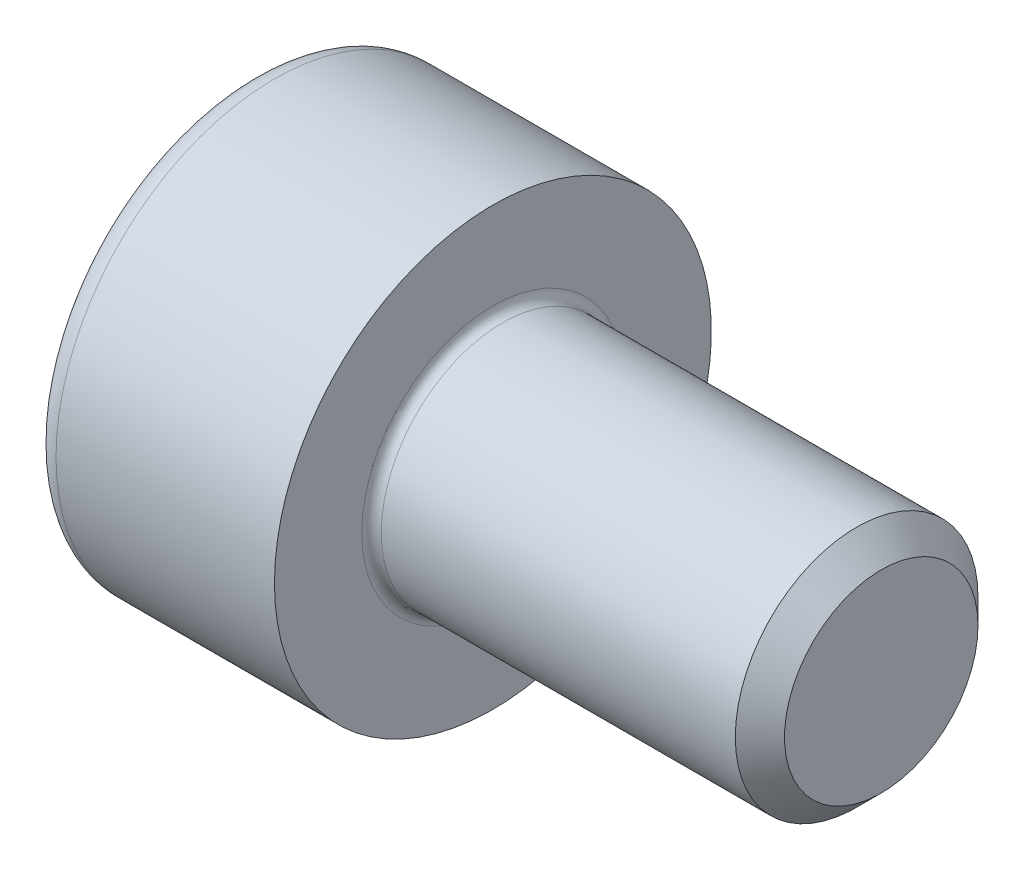
ISO-10303-21;
HEADER;
FILE_DESCRIPTION(('STEP AP214'),'2;1');
FILE_NAME('part.step','',(''),(''),'','','');
FILE_SCHEMA(('AUTOMOTIVE_DESIGN { 1 0 10303 214 1 1 1 1 }'));
ENDSEC;
DATA;
#1=APPLICATION_CONTEXT('core data for automotive mechanical design processes');
#2=APPLICATION_PROTOCOL_DEFINITION('international standard','automotive_design',2000,#1);
#3=PRODUCT_CONTEXT('',#1,'mechanical');
#4=PRODUCT('Part','Part','',(#3));
#5=PRODUCT_RELATED_PRODUCT_CATEGORY('part','',(#4));
#6=PRODUCT_DEFINITION_FORMATION('','',#4);
#7=PRODUCT_DEFINITION_CONTEXT('part definition',#1,'design');
#8=PRODUCT_DEFINITION('design','',#6,#7);
#9=PRODUCT_DEFINITION_SHAPE('','',#8);
#10=(LENGTH_UNIT() NAMED_UNIT(*) SI_UNIT(.MILLI.,.METRE.));
#11=(NAMED_UNIT(*) PLANE_ANGLE_UNIT() SI_UNIT($,.RADIAN.));
#12=(NAMED_UNIT(*) SI_UNIT($,.STERADIAN.) SOLID_ANGLE_UNIT());
#13=UNCERTAINTY_MEASURE_WITH_UNIT(LENGTH_MEASURE(1.E-05),#10,'distance_accuracy_value','');
#14=(GEOMETRIC_REPRESENTATION_CONTEXT(3) GLOBAL_UNCERTAINTY_ASSIGNED_CONTEXT((#13)) GLOBAL_UNIT_ASSIGNED_CONTEXT((#10,
#11,#12)) REPRESENTATION_CONTEXT('',''));
#15=CARTESIAN_POINT('',(0.,0.,0.));
#16=DIRECTION('',(0.,0.,1.));
#17=DIRECTION('',(1.,0.,0.));
#18=AXIS2_PLACEMENT_3D('',#15,#16,#17);
#19=CARTESIAN_POINT('',(1.1,0.,0.));
#20=DIRECTION('',(-1.,0.,0.));
#21=DIRECTION('',(0.,0.,1.));
#22=AXIS2_PLACEMENT_3D('',#19,#20,#21);
#23=PLANE('',#22);
#24=DIRECTION('',(0.,-1.,0.));
#25=VECTOR('',#24,1.);
#26=CARTESIAN_POINT('',(1.1,0.583123771881514,-1.01));
#27=LINE('',#26,#25);
#28=CARTESIAN_POINT('',(1.1,0.583123771881514,-1.01));
#29=VERTEX_POINT('',#28);
#30=CARTESIAN_POINT('',(1.10000000034899,0.,-1.01));
#31=VERTEX_POINT('',#30);
#32=EDGE_CURVE('E249',#29,#31,#27,.T.);
#33=ORIENTED_EDGE('',*,*,#32,.T.);
#34=CARTESIAN_POINT('',(1.10000000034899,0.,0.));
#35=DIRECTION('',(1.,0.,0.));
#36=DIRECTION('',(0.,0.,-1.));
#37=AXIS2_PLACEMENT_3D('',#34,#35,#36);
#38=CIRCLE('',#37,1.01000000021492);
#39=CARTESIAN_POINT('',(1.10000000034899,0.87468565800841,-0.505000000107462));
#40=VERTEX_POINT('',#39);
#41=EDGE_CURVE('E49',#31,#40,#38,.T.);
#42=ORIENTED_EDGE('',*,*,#41,.T.);
#43=DIRECTION('',(0.,-0.500000000000001,-0.866025403784438));
#44=VECTOR('',#43,1.);
#45=CARTESIAN_POINT('',(1.1,1.16624754376304,0.));
#46=LINE('',#45,#44);
#47=EDGE_CURVE('E265',#40,#29,#46,.T.);
#48=ORIENTED_EDGE('',*,*,#47,.T.);
#49=EDGE_LOOP('',(#33,#42,#48));
#50=FACE_BOUND('',#49,.T.);
#51=ADVANCED_FACE('F34',(#50),#23,.T.);
#52=CARTESIAN_POINT('',(1.1,1.16624754376304,0.));
#53=VERTEX_POINT('',#52);
#54=EDGE_CURVE('E213',#53,#40,#46,.T.);
#55=ORIENTED_EDGE('',*,*,#54,.T.);
#56=CARTESIAN_POINT('',(1.10000000034899,0.874685658008412,0.505000000107459));
#57=VERTEX_POINT('',#56);
#58=EDGE_CURVE('E210',#40,#57,#38,.T.);
#59=ORIENTED_EDGE('',*,*,#58,.T.);
#60=DIRECTION('',(0.,0.499999999999998,-0.86602540378444));
#61=VECTOR('',#60,1.);
#62=CARTESIAN_POINT('',(1.1,0.583123771881518,1.00999999999999));
#63=LINE('',#62,#61);
#64=EDGE_CURVE('E262',#57,#53,#63,.T.);
#65=ORIENTED_EDGE('',*,*,#64,.T.);
#66=EDGE_LOOP('',(#55,#59,#65));
#67=FACE_BOUND('',#66,.T.);
#68=ADVANCED_FACE('F124',(#67),#23,.T.);
#69=CARTESIAN_POINT('',(1.1,0.583123771881518,1.00999999999999));
#70=VERTEX_POINT('',#69);
#71=EDGE_CURVE('E263',#70,#57,#63,.T.);
#72=ORIENTED_EDGE('',*,*,#71,.T.);
#73=CARTESIAN_POINT('',(1.10000000034899,0.,1.01000000021492));
#74=VERTEX_POINT('',#73);
#75=EDGE_CURVE('E243',#57,#74,#38,.T.);
#76=ORIENTED_EDGE('',*,*,#75,.T.);
#77=DIRECTION('',(0.,1.,0.));
#78=VECTOR('',#77,1.);
#79=CARTESIAN_POINT('',(1.1,-0.583123771881526,1.01));
#80=LINE('',#79,#78);
#81=EDGE_CURVE('E259',#74,#70,#80,.T.);
#82=ORIENTED_EDGE('',*,*,#81,.T.);
#83=EDGE_LOOP('',(#72,#76,#82));
#84=FACE_BOUND('',#83,.T.);
#85=ADVANCED_FACE('F129',(#84),#23,.T.);
#86=CARTESIAN_POINT('',(1.1,-0.583123771881526,1.01));
#87=VERTEX_POINT('',#86);
#88=EDGE_CURVE('E260',#87,#74,#80,.T.);
#89=ORIENTED_EDGE('',*,*,#88,.T.);
#90=CARTESIAN_POINT('',(1.10000000034899,-0.87468565800841,0.505000000107462));
#91=VERTEX_POINT('',#90);
#92=EDGE_CURVE('E247',#74,#91,#38,.T.);
#93=ORIENTED_EDGE('',*,*,#92,.T.);
#94=DIRECTION('',(0.,0.500000000000001,0.866025403784438));
#95=VECTOR('',#94,1.);
#96=CARTESIAN_POINT('',(1.1,-1.16624754376305,0.));
#97=LINE('',#96,#95);
#98=EDGE_CURVE('E255',#91,#87,#97,.T.);
#99=ORIENTED_EDGE('',*,*,#98,.T.);
#100=EDGE_LOOP('',(#89,#93,#99));
#101=FACE_BOUND('',#100,.T.);
#102=ADVANCED_FACE('F282',(#101),#23,.T.);
#103=CARTESIAN_POINT('',(1.1,-1.16624754376305,0.));
#104=VERTEX_POINT('',#103);
#105=EDGE_CURVE('E256',#104,#91,#97,.T.);
#106=ORIENTED_EDGE('',*,*,#105,.T.);
#107=CARTESIAN_POINT('',(1.10000000034899,-0.874685658008412,-0.505000000107459));
#108=VERTEX_POINT('',#107);
#109=EDGE_CURVE('E276',#91,#108,#38,.T.);
#110=ORIENTED_EDGE('',*,*,#109,.T.);
#111=DIRECTION('',(0.,-0.499999999999998,0.86602540378444));
#112=VECTOR('',#111,1.);
#113=CARTESIAN_POINT('',(1.1,-0.583123771881529,-1.01));
#114=LINE('',#113,#112);
#115=EDGE_CURVE('E251',#108,#104,#114,.T.);
#116=ORIENTED_EDGE('',*,*,#115,.T.);
#117=EDGE_LOOP('',(#106,#110,#116));
#118=FACE_BOUND('',#117,.T.);
#119=ADVANCED_FACE('F122',(#118),#23,.T.);
#120=CARTESIAN_POINT('',(2.5,0.,0.));
#121=DIRECTION('',(-1.,0.,0.));
#122=DIRECTION('',(0.,0.,1.));
#123=AXIS2_PLACEMENT_3D('',#120,#121,#122);
#124=CYLINDRICAL_SURFACE('',#123,2.25);
#125=CARTESIAN_POINT('',(0.25,0.,0.));
#126=DIRECTION('',(-1.,0.,0.));
#127=DIRECTION('',(0.,0.,1.));
#128=AXIS2_PLACEMENT_3D('',#125,#126,#127);
#129=CIRCLE('',#128,2.25);
#130=CARTESIAN_POINT('',(0.25,0.,2.25));
#131=VERTEX_POINT('',#130);
#132=EDGE_CURVE('E11',#131,#131,#129,.F.);
#133=ORIENTED_EDGE('',*,*,#132,.T.);
#134=EDGE_LOOP('',(#133));
#135=FACE_BOUND('',#134,.T.);
#136=CARTESIAN_POINT('',(2.5,0.,0.));
#137=DIRECTION('',(-1.,0.,0.));
#138=DIRECTION('',(0.,0.,1.));
#139=AXIS2_PLACEMENT_3D('',#136,#137,#138);
#140=CIRCLE('',#139,2.25);
#141=CARTESIAN_POINT('',(2.5,0.,2.25));
#142=VERTEX_POINT('',#141);
#143=EDGE_CURVE('E228',#142,#142,#140,.T.);
#144=ORIENTED_EDGE('',*,*,#143,.T.);
#145=EDGE_LOOP('',(#144));
#146=FACE_BOUND('',#145,.T.);
#147=ADVANCED_FACE('F170',(#135,#146),#124,.T.);
#148=CARTESIAN_POINT('',(2.5,2.25,0.));
#149=DIRECTION('',(1.,0.,0.));
#150=DIRECTION('',(0.,0.,-1.));
#151=AXIS2_PLACEMENT_3D('',#148,#149,#150);
#152=PLANE('',#151);
#153=CARTESIAN_POINT('',(2.5,0.,0.));
#154=DIRECTION('',(1.,0.,0.));
#155=DIRECTION('',(0.,0.,-1.));
#156=AXIS2_PLACEMENT_3D('',#153,#154,#155);
#157=CIRCLE('',#156,1.35);
#158=CARTESIAN_POINT('',(2.5,0.,-1.35));
#159=VERTEX_POINT('',#158);
#160=EDGE_CURVE('E183',#159,#159,#157,.F.);
#161=ORIENTED_EDGE('',*,*,#160,.T.);
#162=EDGE_LOOP('',(#161));
#163=FACE_BOUND('',#162,.T.);
#164=ORIENTED_EDGE('',*,*,#143,.F.);
#165=EDGE_LOOP('',(#164));
#166=FACE_BOUND('',#165,.T.);
#167=ADVANCED_FACE('F166',(#163,#166),#152,.T.);
#168=CARTESIAN_POINT('',(0.,0.,0.));
#169=DIRECTION('',(-1.,0.,0.));
#170=DIRECTION('',(0.,0.,1.));
#171=AXIS2_PLACEMENT_3D('',#168,#169,#170);
#172=PLANE('',#171);
#173=CARTESIAN_POINT('',(0.,0.,0.));
#174=DIRECTION('',(-1.,0.,0.));
#175=DIRECTION('',(0.,0.,1.));
#176=AXIS2_PLACEMENT_3D('',#173,#174,#175);
#177=CIRCLE('',#176,2.);
#178=CARTESIAN_POINT('',(0.,0.,2.));
#179=VERTEX_POINT('',#178);
#180=EDGE_CURVE('E42',#179,#179,#177,.T.);
#181=ORIENTED_EDGE('',*,*,#180,.T.);
#182=EDGE_LOOP('',(#181));
#183=FACE_BOUND('',#182,.T.);
#184=DIRECTION('',(0.,-1.,0.));
#185=VECTOR('',#184,1.);
#186=CARTESIAN_POINT('',(0.,0.583123771881514,-1.01));
#187=LINE('',#186,#185);
#188=CARTESIAN_POINT('',(0.,0.583123771881514,-1.01));
#189=VERTEX_POINT('',#188);
#190=CARTESIAN_POINT('',(0.,-0.583123771881529,-1.01));
#191=VERTEX_POINT('',#190);
#192=EDGE_CURVE('E57',#189,#191,#187,.T.);
#193=ORIENTED_EDGE('',*,*,#192,.F.);
#194=DIRECTION('',(0.,-0.500000000000001,-0.866025403784438));
#195=VECTOR('',#194,1.);
#196=CARTESIAN_POINT('',(0.,1.16624754376304,0.));
#197=LINE('',#196,#195);
#198=CARTESIAN_POINT('',(0.,1.16624754376304,0.));
#199=VERTEX_POINT('',#198);
#200=EDGE_CURVE('E202',#199,#189,#197,.T.);
#201=ORIENTED_EDGE('',*,*,#200,.F.);
#202=DIRECTION('',(0.,0.499999999999998,-0.86602540378444));
#203=VECTOR('',#202,1.);
#204=CARTESIAN_POINT('',(0.,0.583123771881518,1.00999999999999));
#205=LINE('',#204,#203);
#206=CARTESIAN_POINT('',(0.,0.583123771881518,1.00999999999999));
#207=VERTEX_POINT('',#206);
#208=EDGE_CURVE('E221',#207,#199,#205,.T.);
#209=ORIENTED_EDGE('',*,*,#208,.F.);
#210=DIRECTION('',(0.,1.,0.));
#211=VECTOR('',#210,1.);
#212=CARTESIAN_POINT('',(0.,-0.583123771881526,1.01));
#213=LINE('',#212,#211);
#214=CARTESIAN_POINT('',(0.,-0.583123771881526,1.01));
#215=VERTEX_POINT('',#214);
#216=EDGE_CURVE('E218',#215,#207,#213,.T.);
#217=ORIENTED_EDGE('',*,*,#216,.F.);
#218=DIRECTION('',(0.,0.500000000000001,0.866025403784438));
#219=VECTOR('',#218,1.);
#220=CARTESIAN_POINT('',(0.,-1.16624754376305,0.));
#221=LINE('',#220,#219);
#222=CARTESIAN_POINT('',(0.,-1.16624754376305,0.));
#223=VERTEX_POINT('',#222);
#224=EDGE_CURVE('E207',#223,#215,#221,.T.);
#225=ORIENTED_EDGE('',*,*,#224,.F.);
#226=DIRECTION('',(0.,-0.499999999999998,0.86602540378444));
#227=VECTOR('',#226,1.);
#228=CARTESIAN_POINT('',(0.,-0.583123771881529,-1.01));
#229=LINE('',#228,#227);
#230=EDGE_CURVE('E205',#191,#223,#229,.T.);
#231=ORIENTED_EDGE('',*,*,#230,.F.);
#232=EDGE_LOOP('',(#193,#201,#209,#217,#225,#231));
#233=FACE_BOUND('',#232,.T.);
#234=ADVANCED_FACE('F162',(#183,#233),#172,.T.);
#235=CARTESIAN_POINT('',(6.5,0.,0.));
#236=DIRECTION('',(-1.,0.,0.));
#237=DIRECTION('',(0.,0.,1.));
#238=AXIS2_PLACEMENT_3D('',#235,#236,#237);
#239=CYLINDRICAL_SURFACE('',#238,1.25);
#240=CARTESIAN_POINT('',(2.6,0.,0.));
#241=DIRECTION('',(1.,0.,0.));
#242=DIRECTION('',(0.,0.,-1.));
#243=AXIS2_PLACEMENT_3D('',#240,#241,#242);
#244=CIRCLE('',#243,1.25);
#245=CARTESIAN_POINT('',(2.6,0.,-1.25));
#246=VERTEX_POINT('',#245);
#247=EDGE_CURVE('E186',#246,#246,#244,.T.);
#248=ORIENTED_EDGE('',*,*,#247,.T.);
#249=EDGE_LOOP('',(#248));
#250=FACE_BOUND('',#249,.T.);
#251=CARTESIAN_POINT('',(6.24649999998418,0.,0.));
#252=DIRECTION('',(1.,0.,0.));
#253=DIRECTION('',(0.,0.,-1.));
#254=AXIS2_PLACEMENT_3D('',#251,#252,#253);
#255=CIRCLE('',#254,1.25);
#256=CARTESIAN_POINT('',(6.24649999998418,0.,-1.25));
#257=VERTEX_POINT('',#256);
#258=EDGE_CURVE('E187',#257,#257,#255,.F.);
#259=ORIENTED_EDGE('',*,*,#258,.T.);
#260=EDGE_LOOP('',(#259));
#261=FACE_BOUND('',#260,.T.);
#262=ADVANCED_FACE('F158',(#250,#261),#239,.T.);
#263=CARTESIAN_POINT('',(6.5,0.,0.));
#264=DIRECTION('',(1.,0.,0.));
#265=DIRECTION('',(0.,0.,-1.));
#266=AXIS2_PLACEMENT_3D('',#263,#264,#265);
#267=PLANE('',#266);
#268=CARTESIAN_POINT('',(6.5,0.,0.));
#269=DIRECTION('',(1.,0.,0.));
#270=DIRECTION('',(0.,0.,-1.));
#271=AXIS2_PLACEMENT_3D('',#268,#269,#270);
#272=CIRCLE('',#271,0.996499999984178);
#273=CARTESIAN_POINT('',(6.5,0.,-0.996499999984178));
#274=VERTEX_POINT('',#273);
#275=EDGE_CURVE('E191',#274,#274,#272,.T.);
#276=ORIENTED_EDGE('',*,*,#275,.T.);
#277=EDGE_LOOP('',(#276));
#278=FACE_BOUND('',#277,.T.);
#279=ADVANCED_FACE('F155',(#278),#267,.T.);
#280=CARTESIAN_POINT('',(1.1,0.583123771881514,-1.01));
#281=DIRECTION('',(0.,0.,-1.));
#282=DIRECTION('',(0.,1.,0.));
#283=AXIS2_PLACEMENT_3D('',#280,#281,#282);
#284=PLANE('',#283);
#285=ORIENTED_EDGE('',*,*,#192,.T.);
#286=DIRECTION('',(-1.,0.,0.));
#287=VECTOR('',#286,1.);
#288=CARTESIAN_POINT('',(1.1,-0.583123771881529,-1.01));
#289=LINE('',#288,#287);
#290=CARTESIAN_POINT('',(1.1,-0.583123771881529,-1.01));
#291=VERTEX_POINT('',#290);
#292=EDGE_CURVE('E237',#291,#191,#289,.T.);
#293=ORIENTED_EDGE('',*,*,#292,.F.);
#294=EDGE_CURVE('E225',#31,#291,#27,.T.);
#295=ORIENTED_EDGE('',*,*,#294,.F.);
#296=ORIENTED_EDGE('',*,*,#32,.F.);
#297=DIRECTION('',(-1.,0.,0.));
#298=VECTOR('',#297,1.);
#299=CARTESIAN_POINT('',(1.1,0.583123771881514,-1.01));
#300=LINE('',#299,#298);
#301=EDGE_CURVE('E226',#29,#189,#300,.T.);
#302=ORIENTED_EDGE('',*,*,#301,.T.);
#303=EDGE_LOOP('',(#285,#293,#295,#296,#302));
#304=FACE_BOUND('',#303,.T.);
#305=ADVANCED_FACE('F137',(#304),#284,.F.);
#306=CARTESIAN_POINT('',(1.1,1.16624754376304,0.));
#307=DIRECTION('',(0.,0.866025403784438,-0.500000000000001));
#308=DIRECTION('',(0.,0.500000000000001,0.866025403784438));
#309=AXIS2_PLACEMENT_3D('',#306,#307,#308);
#310=PLANE('',#309);
#311=ORIENTED_EDGE('',*,*,#200,.T.);
#312=ORIENTED_EDGE('',*,*,#301,.F.);
#313=ORIENTED_EDGE('',*,*,#47,.F.);
#314=ORIENTED_EDGE('',*,*,#54,.F.);
#315=DIRECTION('',(-1.,0.,0.));
#316=VECTOR('',#315,1.);
#317=CARTESIAN_POINT('',(1.1,1.16624754376304,0.));
#318=LINE('',#317,#316);
#319=EDGE_CURVE('E229',#53,#199,#318,.T.);
#320=ORIENTED_EDGE('',*,*,#319,.T.);
#321=EDGE_LOOP('',(#311,#312,#313,#314,#320));
#322=FACE_BOUND('',#321,.T.);
#323=ADVANCED_FACE('F133',(#322),#310,.F.);
#324=CARTESIAN_POINT('',(1.1,0.583123771881518,1.00999999999999));
#325=DIRECTION('',(0.,0.86602540378444,0.499999999999998));
#326=DIRECTION('',(0.,-0.499999999999998,0.86602540378444));
#327=AXIS2_PLACEMENT_3D('',#324,#325,#326);
#328=PLANE('',#327);
#329=ORIENTED_EDGE('',*,*,#208,.T.);
#330=ORIENTED_EDGE('',*,*,#319,.F.);
#331=ORIENTED_EDGE('',*,*,#64,.F.);
#332=ORIENTED_EDGE('',*,*,#71,.F.);
#333=DIRECTION('',(-1.,0.,0.));
#334=VECTOR('',#333,1.);
#335=CARTESIAN_POINT('',(1.1,0.583123771881518,1.00999999999999));
#336=LINE('',#335,#334);
#337=EDGE_CURVE('E231',#70,#207,#336,.T.);
#338=ORIENTED_EDGE('',*,*,#337,.T.);
#339=EDGE_LOOP('',(#329,#330,#331,#332,#338));
#340=FACE_BOUND('',#339,.T.);
#341=ADVANCED_FACE('F136',(#340),#328,.F.);
#342=CARTESIAN_POINT('',(1.1,-0.583123771881526,1.01));
#343=DIRECTION('',(0.,0.,1.));
#344=DIRECTION('',(0.,-1.,0.));
#345=AXIS2_PLACEMENT_3D('',#342,#343,#344);
#346=PLANE('',#345);
#347=ORIENTED_EDGE('',*,*,#216,.T.);
#348=ORIENTED_EDGE('',*,*,#337,.F.);
#349=ORIENTED_EDGE('',*,*,#81,.F.);
#350=ORIENTED_EDGE('',*,*,#88,.F.);
#351=DIRECTION('',(-1.,0.,0.));
#352=VECTOR('',#351,1.);
#353=CARTESIAN_POINT('',(1.1,-0.583123771881526,1.01));
#354=LINE('',#353,#352);
#355=EDGE_CURVE('E233',#87,#215,#354,.T.);
#356=ORIENTED_EDGE('',*,*,#355,.T.);
#357=EDGE_LOOP('',(#347,#348,#349,#350,#356));
#358=FACE_BOUND('',#357,.T.);
#359=ADVANCED_FACE('F141',(#358),#346,.F.);
#360=CARTESIAN_POINT('',(1.1,-1.16624754376305,0.));
#361=DIRECTION('',(0.,-0.866025403784438,0.500000000000001));
#362=DIRECTION('',(0.,-0.500000000000001,-0.866025403784438));
#363=AXIS2_PLACEMENT_3D('',#360,#361,#362);
#364=PLANE('',#363);
#365=ORIENTED_EDGE('',*,*,#224,.T.);
#366=ORIENTED_EDGE('',*,*,#355,.F.);
#367=ORIENTED_EDGE('',*,*,#98,.F.);
#368=ORIENTED_EDGE('',*,*,#105,.F.);
#369=DIRECTION('',(-1.,0.,0.));
#370=VECTOR('',#369,1.);
#371=CARTESIAN_POINT('',(1.1,-1.16624754376305,0.));
#372=LINE('',#371,#370);
#373=EDGE_CURVE('E235',#104,#223,#372,.T.);
#374=ORIENTED_EDGE('',*,*,#373,.T.);
#375=EDGE_LOOP('',(#365,#366,#367,#368,#374));
#376=FACE_BOUND('',#375,.T.);
#377=ADVANCED_FACE('F145',(#376),#364,.F.);
#378=CARTESIAN_POINT('',(1.1,-0.583123771881529,-1.01));
#379=DIRECTION('',(0.,-0.86602540378444,-0.499999999999998));
#380=DIRECTION('',(0.,0.499999999999998,-0.86602540378444));
#381=AXIS2_PLACEMENT_3D('',#378,#379,#380);
#382=PLANE('',#381);
#383=ORIENTED_EDGE('',*,*,#230,.T.);
#384=ORIENTED_EDGE('',*,*,#373,.F.);
#385=ORIENTED_EDGE('',*,*,#115,.F.);
#386=EDGE_CURVE('E252',#291,#108,#114,.T.);
#387=ORIENTED_EDGE('',*,*,#386,.F.);
#388=ORIENTED_EDGE('',*,*,#292,.T.);
#389=EDGE_LOOP('',(#383,#384,#385,#387,#388));
#390=FACE_BOUND('',#389,.T.);
#391=ADVANCED_FACE('F119',(#390),#382,.F.);
#392=ORIENTED_EDGE('',*,*,#386,.T.);
#393=EDGE_CURVE('E211',#108,#31,#38,.T.);
#394=ORIENTED_EDGE('',*,*,#393,.T.);
#395=ORIENTED_EDGE('',*,*,#294,.T.);
#396=EDGE_LOOP('',(#392,#394,#395));
#397=FACE_BOUND('',#396,.T.);
#398=ADVANCED_FACE('F110',(#397),#23,.T.);
#399=CARTESIAN_POINT('',(1.6831237723546,0.,0.));
#400=DIRECTION('',(-1.,0.,0.));
#401=DIRECTION('',(0.,0.,1.));
#402=AXIS2_PLACEMENT_3D('',#399,#400,#401);
#403=CONICAL_SURFACE('',#402,0.,1.0471975511966);
#404=ORIENTED_EDGE('',*,*,#41,.F.);
#405=ORIENTED_EDGE('',*,*,#393,.F.);
#406=ORIENTED_EDGE('',*,*,#109,.F.);
#407=ORIENTED_EDGE('',*,*,#92,.F.);
#408=ORIENTED_EDGE('',*,*,#75,.F.);
#409=ORIENTED_EDGE('',*,*,#58,.F.);
#410=EDGE_LOOP('',(#404,#405,#406,#407,#408,#409));
#411=FACE_BOUND('',#410,.T.);
#412=CARTESIAN_POINT('',(1.6831237723546,0.,0.));
#413=VERTEX_POINT('',#412);
#414=VERTEX_LOOP('',#413);
#415=FACE_BOUND('',#414,.T.);
#416=ADVANCED_FACE('F107',(#411,#415),#403,.F.);
#417=CARTESIAN_POINT('',(6.5,0.,0.));
#418=DIRECTION('',(-1.,0.,0.));
#419=DIRECTION('',(0.,0.,1.));
#420=AXIS2_PLACEMENT_3D('',#417,#418,#419);
#421=CONICAL_SURFACE('',#420,0.996499999984178,0.785398163397445);
#422=ORIENTED_EDGE('',*,*,#258,.F.);
#423=EDGE_LOOP('',(#422));
#424=FACE_BOUND('',#423,.T.);
#425=ORIENTED_EDGE('',*,*,#275,.F.);
#426=EDGE_LOOP('',(#425));
#427=FACE_BOUND('',#426,.T.);
#428=ADVANCED_FACE('F109',(#424,#427),#421,.T.);
#429=CARTESIAN_POINT('',(2.6,0.,0.));
#430=DIRECTION('',(1.,0.,0.));
#431=DIRECTION('',(0.,0.,-1.));
#432=AXIS2_PLACEMENT_3D('',#429,#430,#431);
#433=TOROIDAL_SURFACE('',#432,1.35,0.1);
#434=ORIENTED_EDGE('',*,*,#160,.F.);
#435=EDGE_LOOP('',(#434));
#436=FACE_BOUND('',#435,.T.);
#437=ORIENTED_EDGE('',*,*,#247,.F.);
#438=EDGE_LOOP('',(#437));
#439=FACE_BOUND('',#438,.T.);
#440=ADVANCED_FACE('F116',(#436,#439),#433,.F.);
#441=CARTESIAN_POINT('',(0.25,0.,0.));
#442=DIRECTION('',(-1.,0.,0.));
#443=DIRECTION('',(0.,0.,1.));
#444=AXIS2_PLACEMENT_3D('',#441,#442,#443);
#445=TOROIDAL_SURFACE('',#444,2.,0.25);
#446=ORIENTED_EDGE('',*,*,#132,.F.);
#447=EDGE_LOOP('',(#446));
#448=FACE_BOUND('',#447,.T.);
#449=ORIENTED_EDGE('',*,*,#180,.F.);
#450=EDGE_LOOP('',(#449));
#451=FACE_BOUND('',#450,.T.);
#452=ADVANCED_FACE('F36',(#448,#451),#445,.T.);
#453=CLOSED_SHELL('',(#51,#68,#85,#102,#119,#147,#167,#234,#262,#279,#305,#323,#341,#359,#377,
#391,#398,#416,#428,#440,#452));
#454=MANIFOLD_SOLID_BREP('B2',#453);
#455=ADVANCED_BREP_SHAPE_REPRESENTATION('',(#18,#454),#14);
#456=SHAPE_DEFINITION_REPRESENTATION(#9,#455);
ENDSEC;
END-ISO-10303-21;
